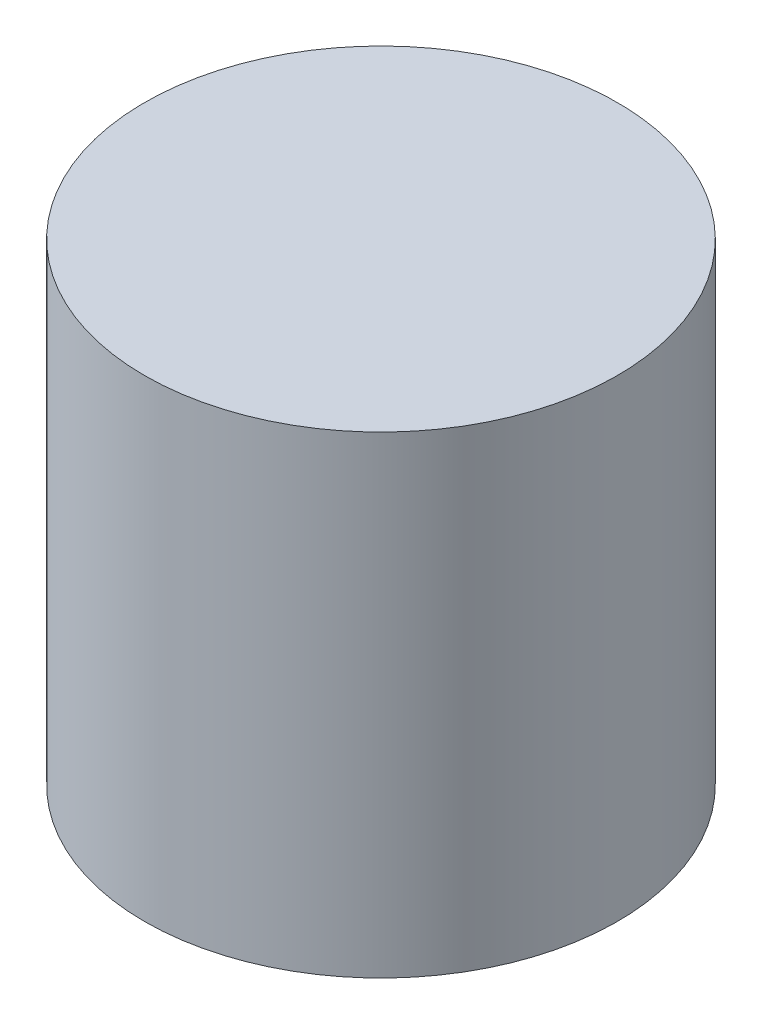
ISO-10303-21;
HEADER;
FILE_DESCRIPTION(('STEP AP214'),'2;1');
FILE_NAME('part.step','',(''),(''),'','','');
FILE_SCHEMA(('AUTOMOTIVE_DESIGN { 1 0 10303 214 1 1 1 1 }'));
ENDSEC;
DATA;
#1=APPLICATION_CONTEXT('core data for automotive mechanical design processes');
#2=APPLICATION_PROTOCOL_DEFINITION('international standard','automotive_design',2000,#1);
#3=PRODUCT_CONTEXT('',#1,'mechanical');
#4=PRODUCT('Part','Part','',(#3));
#5=PRODUCT_RELATED_PRODUCT_CATEGORY('part','',(#4));
#6=PRODUCT_DEFINITION_FORMATION('','',#4);
#7=PRODUCT_DEFINITION_CONTEXT('part definition',#1,'design');
#8=PRODUCT_DEFINITION('design','',#6,#7);
#9=PRODUCT_DEFINITION_SHAPE('','',#8);
#10=(LENGTH_UNIT() NAMED_UNIT(*) SI_UNIT(.MILLI.,.METRE.));
#11=(NAMED_UNIT(*) PLANE_ANGLE_UNIT() SI_UNIT($,.RADIAN.));
#12=(NAMED_UNIT(*) SI_UNIT($,.STERADIAN.) SOLID_ANGLE_UNIT());
#13=UNCERTAINTY_MEASURE_WITH_UNIT(LENGTH_MEASURE(1.E-05),#10,'distance_accuracy_value','');
#14=(GEOMETRIC_REPRESENTATION_CONTEXT(3) GLOBAL_UNCERTAINTY_ASSIGNED_CONTEXT((#13)) GLOBAL_UNIT_ASSIGNED_CONTEXT((#10,
#11,#12)) REPRESENTATION_CONTEXT('',''));
#15=CARTESIAN_POINT('',(0.,0.,0.));
#16=DIRECTION('',(0.,0.,1.));
#17=DIRECTION('',(1.,0.,0.));
#18=AXIS2_PLACEMENT_3D('',#15,#16,#17);
#19=CARTESIAN_POINT('',(0.,6.35,0.));
#20=DIRECTION('',(0.,-1.,0.));
#21=DIRECTION('',(0.,0.,-1.));
#22=AXIS2_PLACEMENT_3D('',#19,#20,#21);
#23=CYLINDRICAL_SURFACE('',#22,3.175);
#24=CARTESIAN_POINT('',(0.,6.35,0.));
#25=DIRECTION('',(0.,1.,0.));
#26=DIRECTION('',(0.,0.,1.));
#27=AXIS2_PLACEMENT_3D('',#24,#25,#26);
#28=CIRCLE('',#27,3.175);
#29=CARTESIAN_POINT('',(0.,6.35,3.175));
#30=VERTEX_POINT('',#29);
#31=EDGE_CURVE('E10',#30,#30,#28,.T.);
#32=ORIENTED_EDGE('',*,*,#31,.F.);
#33=EDGE_LOOP('',(#32));
#34=FACE_BOUND('',#33,.T.);
#35=CARTESIAN_POINT('',(0.,0.,0.));
#36=DIRECTION('',(0.,1.,0.));
#37=DIRECTION('',(0.,0.,1.));
#38=AXIS2_PLACEMENT_3D('',#35,#36,#37);
#39=CIRCLE('',#38,3.175);
#40=CARTESIAN_POINT('',(0.,0.,3.175));
#41=VERTEX_POINT('',#40);
#42=EDGE_CURVE('E38',#41,#41,#39,.T.);
#43=ORIENTED_EDGE('',*,*,#42,.T.);
#44=EDGE_LOOP('',(#43));
#45=FACE_BOUND('',#44,.T.);
#46=ADVANCED_FACE('F35',(#34,#45),#23,.T.);
#47=CARTESIAN_POINT('',(0.,6.35,0.));
#48=DIRECTION('',(0.,1.,0.));
#49=DIRECTION('',(0.,0.,1.));
#50=AXIS2_PLACEMENT_3D('',#47,#48,#49);
#51=PLANE('',#50);
#52=ORIENTED_EDGE('',*,*,#31,.T.);
#53=EDGE_LOOP('',(#52));
#54=FACE_BOUND('',#53,.T.);
#55=ADVANCED_FACE('F50',(#54),#51,.T.);
#56=CARTESIAN_POINT('',(0.,0.,0.));
#57=DIRECTION('',(0.,1.,0.));
#58=DIRECTION('',(0.,0.,1.));
#59=AXIS2_PLACEMENT_3D('',#56,#57,#58);
#60=PLANE('',#59);
#61=ORIENTED_EDGE('',*,*,#42,.F.);
#62=EDGE_LOOP('',(#61));
#63=FACE_BOUND('',#62,.T.);
#64=ADVANCED_FACE('F48',(#63),#60,.F.);
#65=CLOSED_SHELL('',(#46,#55,#64));
#66=MANIFOLD_SOLID_BREP('B2',#65);
#67=ADVANCED_BREP_SHAPE_REPRESENTATION('',(#18,#66),#14);
#68=SHAPE_DEFINITION_REPRESENTATION(#9,#67);
ENDSEC;
END-ISO-10303-21;
